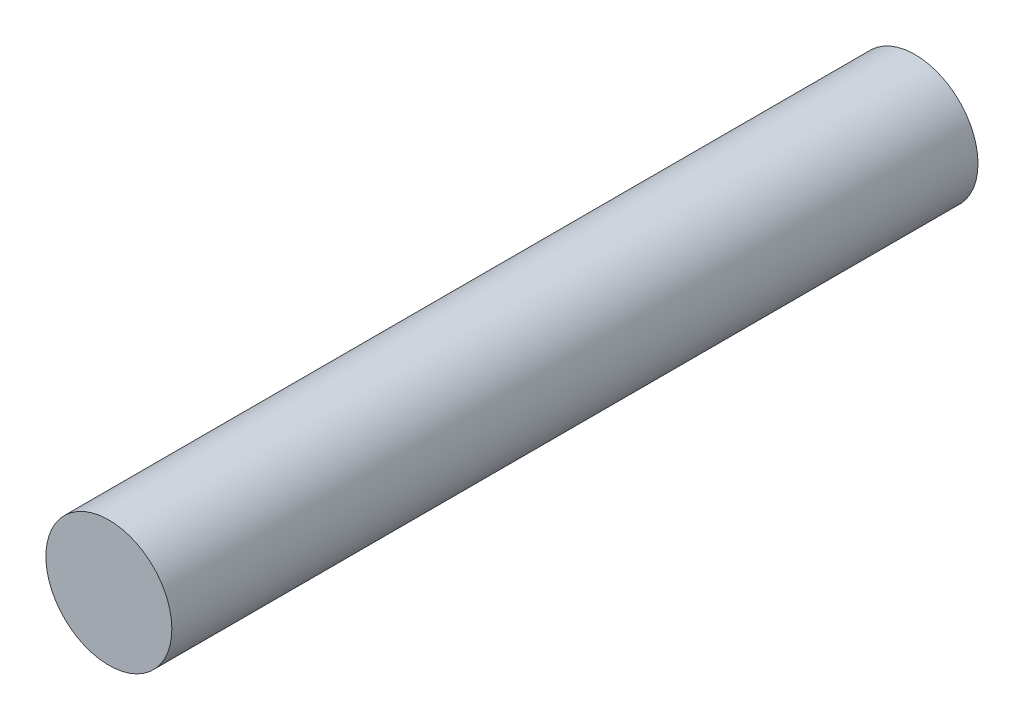
ISO-10303-21;
HEADER;
FILE_DESCRIPTION(('STEP AP214'),'2;1');
FILE_NAME('part.step','',(''),(''),'','','');
FILE_SCHEMA(('AUTOMOTIVE_DESIGN { 1 0 10303 214 1 1 1 1 }'));
ENDSEC;
DATA;
#1=APPLICATION_CONTEXT('core data for automotive mechanical design processes');
#2=APPLICATION_PROTOCOL_DEFINITION('international standard','automotive_design',2000,#1);
#3=PRODUCT_CONTEXT('',#1,'mechanical');
#4=PRODUCT('Part','Part','',(#3));
#5=PRODUCT_RELATED_PRODUCT_CATEGORY('part','',(#4));
#6=PRODUCT_DEFINITION_FORMATION('','',#4);
#7=PRODUCT_DEFINITION_CONTEXT('part definition',#1,'design');
#8=PRODUCT_DEFINITION('design','',#6,#7);
#9=PRODUCT_DEFINITION_SHAPE('','',#8);
#10=(LENGTH_UNIT() NAMED_UNIT(*) SI_UNIT(.MILLI.,.METRE.));
#11=(NAMED_UNIT(*) PLANE_ANGLE_UNIT() SI_UNIT($,.RADIAN.));
#12=(NAMED_UNIT(*) SI_UNIT($,.STERADIAN.) SOLID_ANGLE_UNIT());
#13=UNCERTAINTY_MEASURE_WITH_UNIT(LENGTH_MEASURE(1.E-05),#10,'distance_accuracy_value','');
#14=(GEOMETRIC_REPRESENTATION_CONTEXT(3) GLOBAL_UNCERTAINTY_ASSIGNED_CONTEXT((#13)) GLOBAL_UNIT_ASSIGNED_CONTEXT((#10,
#11,#12)) REPRESENTATION_CONTEXT('',''));
#15=CARTESIAN_POINT('',(0.,0.,0.));
#16=DIRECTION('',(0.,0.,1.));
#17=DIRECTION('',(1.,0.,0.));
#18=AXIS2_PLACEMENT_3D('',#15,#16,#17);
#19=CARTESIAN_POINT('',(0.,0.,32.));
#20=DIRECTION('',(0.,0.,-1.));
#21=DIRECTION('',(-1.,0.,0.));
#22=AXIS2_PLACEMENT_3D('',#19,#20,#21);
#23=CYLINDRICAL_SURFACE('',#22,2.5);
#24=CARTESIAN_POINT('',(0.,0.,32.));
#25=DIRECTION('',(0.,0.,1.));
#26=DIRECTION('',(1.,0.,0.));
#27=AXIS2_PLACEMENT_3D('',#24,#25,#26);
#28=CIRCLE('',#27,2.5);
#29=CARTESIAN_POINT('',(2.5,0.,32.));
#30=VERTEX_POINT('',#29);
#31=EDGE_CURVE('E10',#30,#30,#28,.T.);
#32=ORIENTED_EDGE('',*,*,#31,.F.);
#33=EDGE_LOOP('',(#32));
#34=FACE_BOUND('',#33,.T.);
#35=CARTESIAN_POINT('',(0.,0.,0.));
#36=DIRECTION('',(0.,0.,1.));
#37=DIRECTION('',(1.,0.,0.));
#38=AXIS2_PLACEMENT_3D('',#35,#36,#37);
#39=CIRCLE('',#38,2.5);
#40=CARTESIAN_POINT('',(2.5,0.,0.));
#41=VERTEX_POINT('',#40);
#42=EDGE_CURVE('E46',#41,#41,#39,.T.);
#43=ORIENTED_EDGE('',*,*,#42,.T.);
#44=EDGE_LOOP('',(#43));
#45=FACE_BOUND('',#44,.T.);
#46=ADVANCED_FACE('F43',(#34,#45),#23,.T.);
#47=CARTESIAN_POINT('',(0.,0.,32.));
#48=DIRECTION('',(0.,0.,1.));
#49=DIRECTION('',(1.,0.,0.));
#50=AXIS2_PLACEMENT_3D('',#47,#48,#49);
#51=PLANE('',#50);
#52=ORIENTED_EDGE('',*,*,#31,.T.);
#53=EDGE_LOOP('',(#52));
#54=FACE_BOUND('',#53,.T.);
#55=ADVANCED_FACE('F60',(#54),#51,.T.);
#56=CARTESIAN_POINT('',(0.,0.,0.));
#57=DIRECTION('',(0.,0.,1.));
#58=DIRECTION('',(1.,0.,0.));
#59=AXIS2_PLACEMENT_3D('',#56,#57,#58);
#60=PLANE('',#59);
#61=ORIENTED_EDGE('',*,*,#42,.F.);
#62=EDGE_LOOP('',(#61));
#63=FACE_BOUND('',#62,.T.);
#64=ADVANCED_FACE('F58',(#63),#60,.F.);
#65=CLOSED_SHELL('',(#46,#55,#64));
#66=MANIFOLD_SOLID_BREP('B2',#65);
#67=ADVANCED_BREP_SHAPE_REPRESENTATION('',(#18,#66),#14);
#68=SHAPE_DEFINITION_REPRESENTATION(#9,#67);
ENDSEC;
END-ISO-10303-21;
